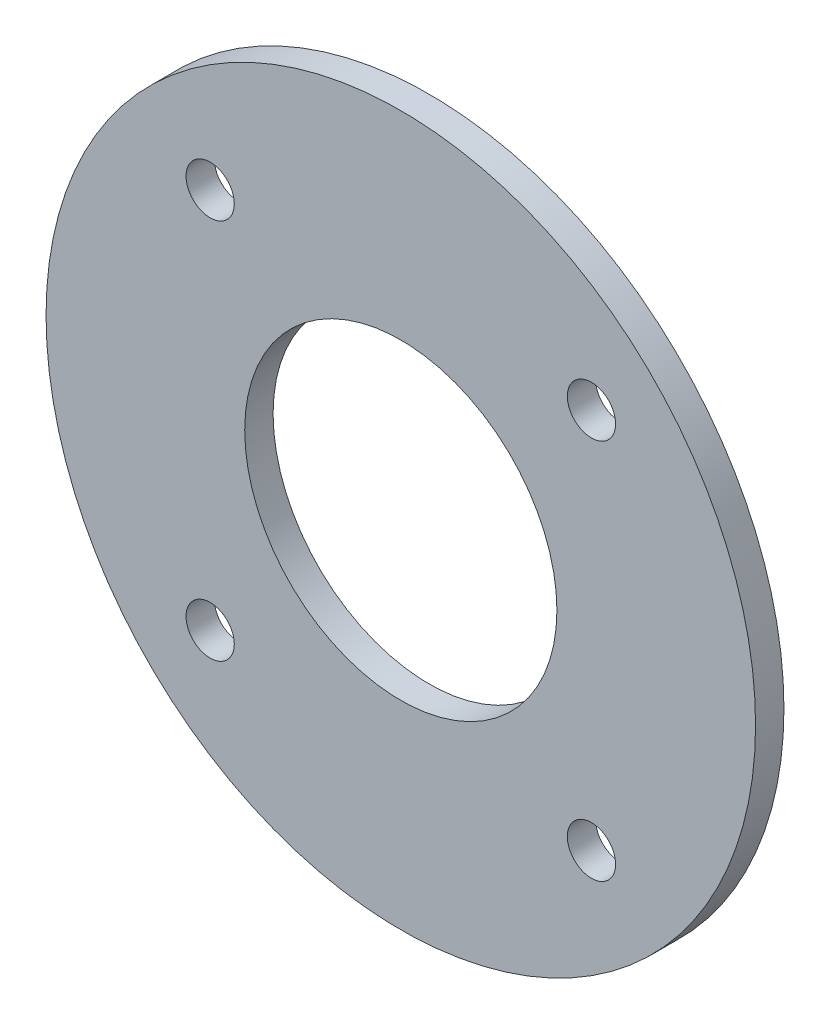
ISO-10303-21;
HEADER;
FILE_DESCRIPTION(('STEP AP214'),'2;1');
FILE_NAME('part.step','',(''),(''),'','','');
FILE_SCHEMA(('AUTOMOTIVE_DESIGN { 1 0 10303 214 1 1 1 1 }'));
ENDSEC;
DATA;
#1=APPLICATION_CONTEXT('core data for automotive mechanical design processes');
#2=APPLICATION_PROTOCOL_DEFINITION('international standard','automotive_design',2000,#1);
#3=PRODUCT_CONTEXT('',#1,'mechanical');
#4=PRODUCT('Part','Part','',(#3));
#5=PRODUCT_RELATED_PRODUCT_CATEGORY('part','',(#4));
#6=PRODUCT_DEFINITION_FORMATION('','',#4);
#7=PRODUCT_DEFINITION_CONTEXT('part definition',#1,'design');
#8=PRODUCT_DEFINITION('design','',#6,#7);
#9=PRODUCT_DEFINITION_SHAPE('','',#8);
#10=(LENGTH_UNIT() NAMED_UNIT(*) SI_UNIT(.MILLI.,.METRE.));
#11=(NAMED_UNIT(*) PLANE_ANGLE_UNIT() SI_UNIT($,.RADIAN.));
#12=(NAMED_UNIT(*) SI_UNIT($,.STERADIAN.) SOLID_ANGLE_UNIT());
#13=UNCERTAINTY_MEASURE_WITH_UNIT(LENGTH_MEASURE(1.E-05),#10,'distance_accuracy_value','');
#14=(GEOMETRIC_REPRESENTATION_CONTEXT(3) GLOBAL_UNCERTAINTY_ASSIGNED_CONTEXT((#13)) GLOBAL_UNIT_ASSIGNED_CONTEXT((#10,
#11,#12)) REPRESENTATION_CONTEXT('',''));
#15=CARTESIAN_POINT('',(0.,0.,0.));
#16=DIRECTION('',(0.,0.,1.));
#17=DIRECTION('',(1.,0.,0.));
#18=AXIS2_PLACEMENT_3D('',#15,#16,#17);
#19=CARTESIAN_POINT('',(0.,0.,-0.0001));
#20=DIRECTION('',(0.,0.,1.));
#21=DIRECTION('',(1.,0.,0.));
#22=AXIS2_PLACEMENT_3D('',#19,#20,#21);
#23=CYLINDRICAL_SURFACE('',#22,25.);
#24=CARTESIAN_POINT('',(0.,0.,-0.0001));
#25=DIRECTION('',(0.,0.,1.));
#26=DIRECTION('',(1.,0.,0.));
#27=AXIS2_PLACEMENT_3D('',#24,#25,#26);
#28=CIRCLE('',#27,25.);
#29=CARTESIAN_POINT('',(25.,0.,-0.0001));
#30=VERTEX_POINT('',#29);
#31=EDGE_CURVE('E10',#30,#30,#28,.T.);
#32=ORIENTED_EDGE('',*,*,#31,.T.);
#33=EDGE_LOOP('',(#32));
#34=FACE_BOUND('',#33,.T.);
#35=CARTESIAN_POINT('',(0.,0.,2.));
#36=DIRECTION('',(0.,0.,1.));
#37=DIRECTION('',(1.,0.,0.));
#38=AXIS2_PLACEMENT_3D('',#35,#36,#37);
#39=CIRCLE('',#38,25.);
#40=CARTESIAN_POINT('',(25.,0.,2.));
#41=VERTEX_POINT('',#40);
#42=EDGE_CURVE('E57',#41,#41,#39,.T.);
#43=ORIENTED_EDGE('',*,*,#42,.F.);
#44=EDGE_LOOP('',(#43));
#45=FACE_BOUND('',#44,.T.);
#46=ADVANCED_FACE('F35',(#34,#45),#23,.T.);
#47=CARTESIAN_POINT('',(0.,0.,-0.0001));
#48=DIRECTION('',(0.,0.,1.));
#49=DIRECTION('',(1.,0.,0.));
#50=AXIS2_PLACEMENT_3D('',#47,#48,#49);
#51=PLANE('',#50);
#52=CARTESIAN_POINT('',(0.,0.,-0.0001));
#53=DIRECTION('',(0.,0.,-1.));
#54=DIRECTION('',(-1.,0.,0.));
#55=AXIS2_PLACEMENT_3D('',#52,#53,#54);
#56=CIRCLE('',#55,11.);
#57=CARTESIAN_POINT('',(-11.,0.,-0.0001));
#58=VERTEX_POINT('',#57);
#59=EDGE_CURVE('E72',#58,#58,#56,.T.);
#60=ORIENTED_EDGE('',*,*,#59,.F.);
#61=EDGE_LOOP('',(#60));
#62=FACE_BOUND('',#61,.T.);
#63=CARTESIAN_POINT('',(-13.4350288425444,-13.4350288425444,-0.0001));
#64=DIRECTION('',(0.,0.,1.));
#65=DIRECTION('',(1.,0.,0.));
#66=AXIS2_PLACEMENT_3D('',#63,#64,#65);
#67=CIRCLE('',#66,1.7);
#68=CARTESIAN_POINT('',(-11.7350288425444,-13.4350288425444,-0.0001));
#69=VERTEX_POINT('',#68);
#70=EDGE_CURVE('E54',#69,#69,#67,.T.);
#71=ORIENTED_EDGE('',*,*,#70,.T.);
#72=EDGE_LOOP('',(#71));
#73=FACE_BOUND('',#72,.T.);
#74=CARTESIAN_POINT('',(13.4350288425444,-13.4350288425444,-0.0001));
#75=DIRECTION('',(0.,0.,1.));
#76=DIRECTION('',(1.,0.,0.));
#77=AXIS2_PLACEMENT_3D('',#74,#75,#76);
#78=CIRCLE('',#77,1.7);
#79=CARTESIAN_POINT('',(15.1350288425444,-13.4350288425444,-0.0001));
#80=VERTEX_POINT('',#79);
#81=EDGE_CURVE('E51',#80,#80,#78,.T.);
#82=ORIENTED_EDGE('',*,*,#81,.T.);
#83=EDGE_LOOP('',(#82));
#84=FACE_BOUND('',#83,.T.);
#85=CARTESIAN_POINT('',(-13.4350288425444,13.4350288425444,-0.0001));
#86=DIRECTION('',(0.,0.,1.));
#87=DIRECTION('',(1.,0.,0.));
#88=AXIS2_PLACEMENT_3D('',#85,#86,#87);
#89=CIRCLE('',#88,1.7);
#90=CARTESIAN_POINT('',(-11.7350288425444,13.4350288425444,-0.0001));
#91=VERTEX_POINT('',#90);
#92=EDGE_CURVE('E46',#91,#91,#89,.T.);
#93=ORIENTED_EDGE('',*,*,#92,.T.);
#94=EDGE_LOOP('',(#93));
#95=FACE_BOUND('',#94,.T.);
#96=CARTESIAN_POINT('',(13.4350288425444,13.4350288425444,-0.0001));
#97=DIRECTION('',(0.,0.,1.));
#98=DIRECTION('',(1.,0.,0.));
#99=AXIS2_PLACEMENT_3D('',#96,#97,#98);
#100=CIRCLE('',#99,1.7);
#101=CARTESIAN_POINT('',(15.1350288425444,13.4350288425444,-0.0001));
#102=VERTEX_POINT('',#101);
#103=EDGE_CURVE('E42',#102,#102,#100,.T.);
#104=ORIENTED_EDGE('',*,*,#103,.T.);
#105=EDGE_LOOP('',(#104));
#106=FACE_BOUND('',#105,.T.);
#107=ORIENTED_EDGE('',*,*,#31,.F.);
#108=EDGE_LOOP('',(#107));
#109=FACE_BOUND('',#108,.T.);
#110=ADVANCED_FACE('F108',(#62,#73,#84,#95,#106,#109),#51,.F.);
#111=CARTESIAN_POINT('',(13.4350288425444,13.4350288425444,-0.0001));
#112=DIRECTION('',(0.,0.,1.));
#113=DIRECTION('',(1.,0.,0.));
#114=AXIS2_PLACEMENT_3D('',#111,#112,#113);
#115=CYLINDRICAL_SURFACE('',#114,1.7);
#116=ORIENTED_EDGE('',*,*,#103,.F.);
#117=EDGE_LOOP('',(#116));
#118=FACE_BOUND('',#117,.T.);
#119=CARTESIAN_POINT('',(13.4350288425444,13.4350288425444,2.));
#120=DIRECTION('',(0.,0.,1.));
#121=DIRECTION('',(1.,0.,0.));
#122=AXIS2_PLACEMENT_3D('',#119,#120,#121);
#123=CIRCLE('',#122,1.7);
#124=CARTESIAN_POINT('',(15.1350288425444,13.4350288425444,2.));
#125=VERTEX_POINT('',#124);
#126=EDGE_CURVE('E60',#125,#125,#123,.T.);
#127=ORIENTED_EDGE('',*,*,#126,.T.);
#128=EDGE_LOOP('',(#127));
#129=FACE_BOUND('',#128,.T.);
#130=ADVANCED_FACE('F112',(#118,#129),#115,.F.);
#131=CARTESIAN_POINT('',(-13.4350288425444,13.4350288425444,-0.0001));
#132=DIRECTION('',(0.,0.,1.));
#133=DIRECTION('',(1.,0.,0.));
#134=AXIS2_PLACEMENT_3D('',#131,#132,#133);
#135=CYLINDRICAL_SURFACE('',#134,1.7);
#136=ORIENTED_EDGE('',*,*,#92,.F.);
#137=EDGE_LOOP('',(#136));
#138=FACE_BOUND('',#137,.T.);
#139=CARTESIAN_POINT('',(-13.4350288425444,13.4350288425444,2.));
#140=DIRECTION('',(0.,0.,1.));
#141=DIRECTION('',(1.,0.,0.));
#142=AXIS2_PLACEMENT_3D('',#139,#140,#141);
#143=CIRCLE('',#142,1.7);
#144=CARTESIAN_POINT('',(-11.7350288425444,13.4350288425444,2.));
#145=VERTEX_POINT('',#144);
#146=EDGE_CURVE('E63',#145,#145,#143,.T.);
#147=ORIENTED_EDGE('',*,*,#146,.T.);
#148=EDGE_LOOP('',(#147));
#149=FACE_BOUND('',#148,.T.);
#150=ADVANCED_FACE('F103',(#138,#149),#135,.F.);
#151=CARTESIAN_POINT('',(13.4350288425444,-13.4350288425444,-0.0001));
#152=DIRECTION('',(0.,0.,1.));
#153=DIRECTION('',(1.,0.,0.));
#154=AXIS2_PLACEMENT_3D('',#151,#152,#153);
#155=CYLINDRICAL_SURFACE('',#154,1.7);
#156=ORIENTED_EDGE('',*,*,#81,.F.);
#157=EDGE_LOOP('',(#156));
#158=FACE_BOUND('',#157,.T.);
#159=CARTESIAN_POINT('',(13.4350288425444,-13.4350288425444,2.));
#160=DIRECTION('',(0.,0.,1.));
#161=DIRECTION('',(1.,0.,0.));
#162=AXIS2_PLACEMENT_3D('',#159,#160,#161);
#163=CIRCLE('',#162,1.7);
#164=CARTESIAN_POINT('',(15.1350288425444,-13.4350288425444,2.));
#165=VERTEX_POINT('',#164);
#166=EDGE_CURVE('E66',#165,#165,#163,.T.);
#167=ORIENTED_EDGE('',*,*,#166,.T.);
#168=EDGE_LOOP('',(#167));
#169=FACE_BOUND('',#168,.T.);
#170=ADVANCED_FACE('F97',(#158,#169),#155,.F.);
#171=CARTESIAN_POINT('',(-13.4350288425444,-13.4350288425444,-0.0001));
#172=DIRECTION('',(0.,0.,1.));
#173=DIRECTION('',(1.,0.,0.));
#174=AXIS2_PLACEMENT_3D('',#171,#172,#173);
#175=CYLINDRICAL_SURFACE('',#174,1.7);
#176=ORIENTED_EDGE('',*,*,#70,.F.);
#177=EDGE_LOOP('',(#176));
#178=FACE_BOUND('',#177,.T.);
#179=CARTESIAN_POINT('',(-13.4350288425444,-13.4350288425444,2.));
#180=DIRECTION('',(0.,0.,1.));
#181=DIRECTION('',(1.,0.,0.));
#182=AXIS2_PLACEMENT_3D('',#179,#180,#181);
#183=CIRCLE('',#182,1.7);
#184=CARTESIAN_POINT('',(-11.7350288425444,-13.4350288425444,2.));
#185=VERTEX_POINT('',#184);
#186=EDGE_CURVE('E69',#185,#185,#183,.T.);
#187=ORIENTED_EDGE('',*,*,#186,.T.);
#188=EDGE_LOOP('',(#187));
#189=FACE_BOUND('',#188,.T.);
#190=ADVANCED_FACE('F84',(#178,#189),#175,.F.);
#191=CARTESIAN_POINT('',(0.,0.,2.));
#192=DIRECTION('',(0.,0.,1.));
#193=DIRECTION('',(1.,0.,0.));
#194=AXIS2_PLACEMENT_3D('',#191,#192,#193);
#195=PLANE('',#194);
#196=CARTESIAN_POINT('',(0.,0.,2.));
#197=DIRECTION('',(0.,0.,1.));
#198=DIRECTION('',(1.,0.,0.));
#199=AXIS2_PLACEMENT_3D('',#196,#197,#198);
#200=CIRCLE('',#199,11.);
#201=CARTESIAN_POINT('',(11.,0.,2.));
#202=VERTEX_POINT('',#201);
#203=EDGE_CURVE('E38',#202,#202,#200,.T.);
#204=ORIENTED_EDGE('',*,*,#203,.F.);
#205=EDGE_LOOP('',(#204));
#206=FACE_BOUND('',#205,.T.);
#207=ORIENTED_EDGE('',*,*,#166,.F.);
#208=EDGE_LOOP('',(#207));
#209=FACE_BOUND('',#208,.T.);
#210=ORIENTED_EDGE('',*,*,#126,.F.);
#211=EDGE_LOOP('',(#210));
#212=FACE_BOUND('',#211,.T.);
#213=ORIENTED_EDGE('',*,*,#42,.T.);
#214=EDGE_LOOP('',(#213));
#215=FACE_BOUND('',#214,.T.);
#216=ORIENTED_EDGE('',*,*,#146,.F.);
#217=EDGE_LOOP('',(#216));
#218=FACE_BOUND('',#217,.T.);
#219=ORIENTED_EDGE('',*,*,#186,.F.);
#220=EDGE_LOOP('',(#219));
#221=FACE_BOUND('',#220,.T.);
#222=ADVANCED_FACE('F81',(#206,#209,#212,#215,#218,#221),#195,.T.);
#223=CARTESIAN_POINT('',(0.,0.,9.9999));
#224=DIRECTION('',(0.,0.,-1.));
#225=DIRECTION('',(-1.,0.,0.));
#226=AXIS2_PLACEMENT_3D('',#223,#224,#225);
#227=CYLINDRICAL_SURFACE('',#226,11.);
#228=ORIENTED_EDGE('',*,*,#203,.T.);
#229=EDGE_LOOP('',(#228));
#230=FACE_BOUND('',#229,.T.);
#231=ORIENTED_EDGE('',*,*,#59,.T.);
#232=EDGE_LOOP('',(#231));
#233=FACE_BOUND('',#232,.T.);
#234=ADVANCED_FACE('F79',(#230,#233),#227,.F.);
#235=CLOSED_SHELL('',(#46,#110,#130,#150,#170,#190,#222,#234));
#236=MANIFOLD_SOLID_BREP('B2',#235);
#237=ADVANCED_BREP_SHAPE_REPRESENTATION('',(#18,#236),#14);
#238=SHAPE_DEFINITION_REPRESENTATION(#9,#237);
ENDSEC;
END-ISO-10303-21;
